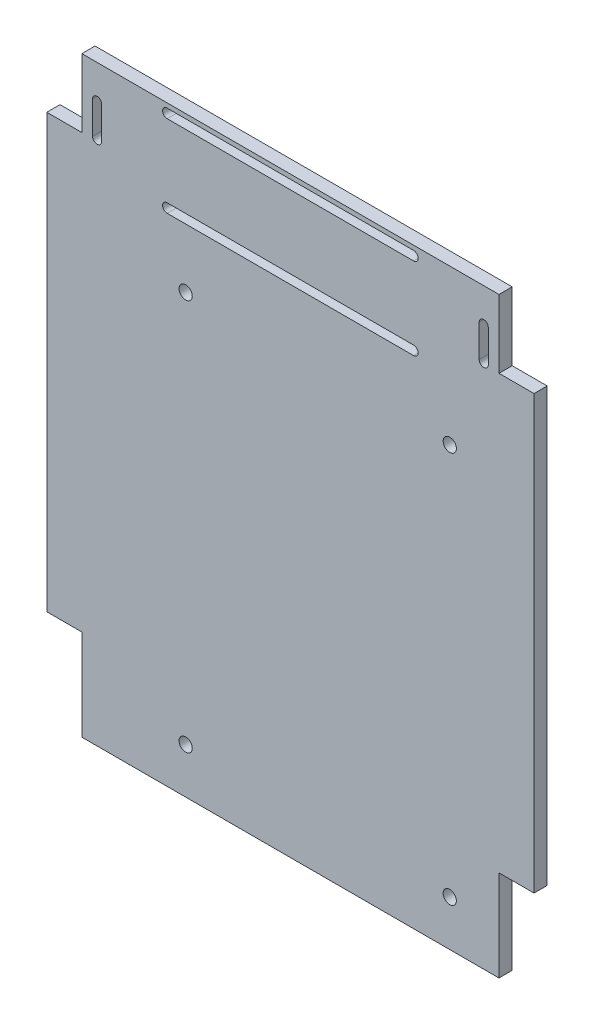
ISO-10303-21;
HEADER;
FILE_DESCRIPTION(('STEP AP214'),'2;1');
FILE_NAME('part.step','',(''),(''),'','','');
FILE_SCHEMA(('AUTOMOTIVE_DESIGN { 1 0 10303 214 1 1 1 1 }'));
ENDSEC;
DATA;
#1=APPLICATION_CONTEXT('core data for automotive mechanical design processes');
#2=APPLICATION_PROTOCOL_DEFINITION('international standard','automotive_design',2000,#1);
#3=PRODUCT_CONTEXT('',#1,'mechanical');
#4=PRODUCT('Part','Part','',(#3));
#5=PRODUCT_RELATED_PRODUCT_CATEGORY('part','',(#4));
#6=PRODUCT_DEFINITION_FORMATION('','',#4);
#7=PRODUCT_DEFINITION_CONTEXT('part definition',#1,'design');
#8=PRODUCT_DEFINITION('design','',#6,#7);
#9=PRODUCT_DEFINITION_SHAPE('','',#8);
#10=(LENGTH_UNIT() NAMED_UNIT(*) SI_UNIT(.MILLI.,.METRE.));
#11=(NAMED_UNIT(*) PLANE_ANGLE_UNIT() SI_UNIT($,.RADIAN.));
#12=(NAMED_UNIT(*) SI_UNIT($,.STERADIAN.) SOLID_ANGLE_UNIT());
#13=UNCERTAINTY_MEASURE_WITH_UNIT(LENGTH_MEASURE(1.E-05),#10,'distance_accuracy_value','');
#14=(GEOMETRIC_REPRESENTATION_CONTEXT(3) GLOBAL_UNCERTAINTY_ASSIGNED_CONTEXT((#13)) GLOBAL_UNIT_ASSIGNED_CONTEXT((#10,
#11,#12)) REPRESENTATION_CONTEXT('',''));
#15=CARTESIAN_POINT('',(0.,0.,0.));
#16=DIRECTION('',(0.,0.,1.));
#17=DIRECTION('',(1.,0.,0.));
#18=AXIS2_PLACEMENT_3D('',#15,#16,#17);
#19=CARTESIAN_POINT('',(0.,0.,2.9));
#20=DIRECTION('',(0.,0.,1.));
#21=DIRECTION('',(1.,0.,0.));
#22=AXIS2_PLACEMENT_3D('',#19,#20,#21);
#23=PLANE('',#22);
#24=CARTESIAN_POINT('',(35.,28.5,2.9));
#25=DIRECTION('',(0.,0.,1.));
#26=DIRECTION('',(1.,0.,0.));
#27=AXIS2_PLACEMENT_3D('',#24,#25,#26);
#28=CIRCLE('',#27,1.45);
#29=CARTESIAN_POINT('',(36.45,28.5,2.9));
#30=VERTEX_POINT('',#29);
#31=EDGE_CURVE('E367',#30,#30,#28,.T.);
#32=ORIENTED_EDGE('',*,*,#31,.F.);
#33=EDGE_LOOP('',(#32));
#34=FACE_BOUND('',#33,.T.);
#35=CARTESIAN_POINT('',(-23.,28.5,2.9));
#36=DIRECTION('',(0.,0.,1.));
#37=DIRECTION('',(1.,0.,0.));
#38=AXIS2_PLACEMENT_3D('',#35,#36,#37);
#39=CIRCLE('',#38,1.45);
#40=CARTESIAN_POINT('',(-21.55,28.5,2.9));
#41=VERTEX_POINT('',#40);
#42=EDGE_CURVE('E383',#41,#41,#39,.T.);
#43=ORIENTED_EDGE('',*,*,#42,.F.);
#44=EDGE_LOOP('',(#43));
#45=FACE_BOUND('',#44,.T.);
#46=DIRECTION('',(-1.,0.,0.));
#47=VECTOR('',#46,1.);
#48=CARTESIAN_POINT('',(45.8039051775926,47.5,2.9));
#49=LINE('',#48,#47);
#50=CARTESIAN_POINT('',(53.5,47.5,2.9));
#51=VERTEX_POINT('',#50);
#52=CARTESIAN_POINT('',(45.8039051775926,47.5,2.9));
#53=VERTEX_POINT('',#52);
#54=EDGE_CURVE('E434',#51,#53,#49,.T.);
#55=ORIENTED_EDGE('',*,*,#54,.T.);
#56=DIRECTION('',(0.,1.,0.));
#57=VECTOR('',#56,1.);
#58=CARTESIAN_POINT('',(45.8039051775926,47.5,2.9));
#59=LINE('',#58,#57);
#60=CARTESIAN_POINT('',(45.8039051775926,62.5,2.9));
#61=VERTEX_POINT('',#60);
#62=EDGE_CURVE('E438',#53,#61,#59,.T.);
#63=ORIENTED_EDGE('',*,*,#62,.T.);
#64=DIRECTION('',(-1.,0.,0.));
#65=VECTOR('',#64,1.);
#66=CARTESIAN_POINT('',(45.8039051775926,62.5,2.9));
#67=LINE('',#66,#65);
#68=CARTESIAN_POINT('',(-45.8,62.5,2.9));
#69=VERTEX_POINT('',#68);
#70=EDGE_CURVE('E442',#61,#69,#67,.T.);
#71=ORIENTED_EDGE('',*,*,#70,.T.);
#72=DIRECTION('',(0.,-1.,0.));
#73=VECTOR('',#72,1.);
#74=CARTESIAN_POINT('',(-45.8,47.5,2.9));
#75=LINE('',#74,#73);
#76=CARTESIAN_POINT('',(-45.8,47.5,2.9));
#77=VERTEX_POINT('',#76);
#78=EDGE_CURVE('E445',#69,#77,#75,.T.);
#79=ORIENTED_EDGE('',*,*,#78,.T.);
#80=DIRECTION('',(-1.,0.,0.));
#81=VECTOR('',#80,1.);
#82=CARTESIAN_POINT('',(-53.5,47.5,2.9));
#83=LINE('',#82,#81);
#84=CARTESIAN_POINT('',(-53.5,47.5,2.9));
#85=VERTEX_POINT('',#84);
#86=EDGE_CURVE('E448',#77,#85,#83,.T.);
#87=ORIENTED_EDGE('',*,*,#86,.T.);
#88=DIRECTION('',(0.,-1.,0.));
#89=VECTOR('',#88,1.);
#90=CARTESIAN_POINT('',(-53.5,-47.5,2.9));
#91=LINE('',#90,#89);
#92=CARTESIAN_POINT('',(-53.5,-47.5,2.9));
#93=VERTEX_POINT('',#92);
#94=EDGE_CURVE('E451',#85,#93,#91,.T.);
#95=ORIENTED_EDGE('',*,*,#94,.T.);
#96=DIRECTION('',(1.,0.,0.));
#97=VECTOR('',#96,1.);
#98=CARTESIAN_POINT('',(-53.5,-47.5,2.9));
#99=LINE('',#98,#97);
#100=CARTESIAN_POINT('',(-45.8,-47.5,2.9));
#101=VERTEX_POINT('',#100);
#102=EDGE_CURVE('E454',#93,#101,#99,.T.);
#103=ORIENTED_EDGE('',*,*,#102,.T.);
#104=DIRECTION('',(0.,-1.,0.));
#105=VECTOR('',#104,1.);
#106=CARTESIAN_POINT('',(-45.8,-47.5,2.9));
#107=LINE('',#106,#105);
#108=CARTESIAN_POINT('',(-45.8,-67.5,2.9));
#109=VERTEX_POINT('',#108);
#110=EDGE_CURVE('E457',#101,#109,#107,.T.);
#111=ORIENTED_EDGE('',*,*,#110,.T.);
#112=DIRECTION('',(1.,0.,0.));
#113=VECTOR('',#112,1.);
#114=CARTESIAN_POINT('',(-45.8,-67.5,2.9));
#115=LINE('',#114,#113);
#116=CARTESIAN_POINT('',(45.8,-67.5,2.9));
#117=VERTEX_POINT('',#116);
#118=EDGE_CURVE('E460',#109,#117,#115,.T.);
#119=ORIENTED_EDGE('',*,*,#118,.T.);
#120=DIRECTION('',(0.,1.,0.));
#121=VECTOR('',#120,1.);
#122=CARTESIAN_POINT('',(45.8,-67.5,2.9));
#123=LINE('',#122,#121);
#124=CARTESIAN_POINT('',(45.8,-47.5,2.9));
#125=VERTEX_POINT('',#124);
#126=EDGE_CURVE('E463',#117,#125,#123,.T.);
#127=ORIENTED_EDGE('',*,*,#126,.T.);
#128=DIRECTION('',(1.,0.,0.));
#129=VECTOR('',#128,1.);
#130=CARTESIAN_POINT('',(45.8,-47.5,2.9));
#131=LINE('',#130,#129);
#132=CARTESIAN_POINT('',(53.5,-47.5,2.9));
#133=VERTEX_POINT('',#132);
#134=EDGE_CURVE('E466',#125,#133,#131,.T.);
#135=ORIENTED_EDGE('',*,*,#134,.T.);
#136=DIRECTION('',(0.,1.,0.));
#137=VECTOR('',#136,1.);
#138=CARTESIAN_POINT('',(53.5,-47.5,2.9));
#139=LINE('',#138,#137);
#140=EDGE_CURVE('E469',#133,#51,#139,.T.);
#141=ORIENTED_EDGE('',*,*,#140,.T.);
#142=EDGE_LOOP('',(#55,#63,#71,#79,#87,#95,#103,#111,#119,#127,#135,#141));
#143=FACE_BOUND('',#142,.T.);
#144=DIRECTION('',(1.,0.,0.));
#145=VECTOR('',#144,1.);
#146=CARTESIAN_POINT('',(-27.0638543828596,59.5,2.9));
#147=LINE('',#146,#145);
#148=CARTESIAN_POINT('',(-27.0638543828596,59.5,2.9));
#149=VERTEX_POINT('',#148);
#150=CARTESIAN_POINT('',(27.0638543828596,59.5,2.9));
#151=VERTEX_POINT('',#150);
#152=EDGE_CURVE('E394',#149,#151,#147,.T.);
#153=ORIENTED_EDGE('',*,*,#152,.F.);
#154=CARTESIAN_POINT('',(-27.0638543828596,60.5,2.9));
#155=DIRECTION('',(0.,0.,1.));
#156=DIRECTION('',(1.,0.,0.));
#157=AXIS2_PLACEMENT_3D('',#154,#155,#156);
#158=CIRCLE('',#157,1.);
#159=CARTESIAN_POINT('',(-27.0638543828596,61.5,2.9));
#160=VERTEX_POINT('',#159);
#161=EDGE_CURVE('E391',#160,#149,#158,.T.);
#162=ORIENTED_EDGE('',*,*,#161,.F.);
#163=DIRECTION('',(-1.,0.,0.));
#164=VECTOR('',#163,1.);
#165=CARTESIAN_POINT('',(-27.0638543828596,61.5,2.9));
#166=LINE('',#165,#164);
#167=CARTESIAN_POINT('',(27.0638543828596,61.5,2.9));
#168=VERTEX_POINT('',#167);
#169=EDGE_CURVE('E402',#168,#160,#166,.T.);
#170=ORIENTED_EDGE('',*,*,#169,.F.);
#171=CARTESIAN_POINT('',(27.0638543828596,60.5,2.9));
#172=DIRECTION('',(0.,0.,1.));
#173=DIRECTION('',(1.,0.,0.));
#174=AXIS2_PLACEMENT_3D('',#171,#172,#173);
#175=CIRCLE('',#174,1.);
#176=EDGE_CURVE('E398',#151,#168,#175,.T.);
#177=ORIENTED_EDGE('',*,*,#176,.F.);
#178=EDGE_LOOP('',(#153,#162,#170,#177));
#179=FACE_BOUND('',#178,.T.);
#180=CARTESIAN_POINT('',(35.,-57.5,2.9));
#181=DIRECTION('',(0.,0.,1.));
#182=DIRECTION('',(1.,0.,0.));
#183=AXIS2_PLACEMENT_3D('',#180,#181,#182);
#184=CIRCLE('',#183,1.44999999999999);
#185=CARTESIAN_POINT('',(36.45,-57.5,2.9));
#186=VERTEX_POINT('',#185);
#187=EDGE_CURVE('E375',#186,#186,#184,.T.);
#188=ORIENTED_EDGE('',*,*,#187,.F.);
#189=EDGE_LOOP('',(#188));
#190=FACE_BOUND('',#189,.T.);
#191=CARTESIAN_POINT('',(-23.,-57.5,2.9));
#192=DIRECTION('',(0.,0.,1.));
#193=DIRECTION('',(1.,0.,0.));
#194=AXIS2_PLACEMENT_3D('',#191,#192,#193);
#195=CIRCLE('',#194,1.44999999999999);
#196=CARTESIAN_POINT('',(-21.55,-57.5,2.9));
#197=VERTEX_POINT('',#196);
#198=EDGE_CURVE('E359',#197,#197,#195,.T.);
#199=ORIENTED_EDGE('',*,*,#198,.F.);
#200=EDGE_LOOP('',(#199));
#201=FACE_BOUND('',#200,.T.);
#202=DIRECTION('',(1.,0.,0.));
#203=VECTOR('',#202,1.);
#204=CARTESIAN_POINT('',(-27.0638543828596,41.5,2.9));
#205=LINE('',#204,#203);
#206=CARTESIAN_POINT('',(-27.0638543828596,41.5,2.9));
#207=VERTEX_POINT('',#206);
#208=CARTESIAN_POINT('',(27.0638543828596,41.5,2.9));
#209=VERTEX_POINT('',#208);
#210=EDGE_CURVE('E319',#207,#209,#205,.T.);
#211=ORIENTED_EDGE('',*,*,#210,.F.);
#212=CARTESIAN_POINT('',(-27.0638543828596,42.5,2.9));
#213=DIRECTION('',(0.,0.,1.));
#214=DIRECTION('',(-1.,0.,0.));
#215=AXIS2_PLACEMENT_3D('',#212,#213,#214);
#216=CIRCLE('',#215,1.);
#217=CARTESIAN_POINT('',(-27.0638543828596,43.5,2.9));
#218=VERTEX_POINT('',#217);
#219=EDGE_CURVE('E316',#218,#207,#216,.T.);
#220=ORIENTED_EDGE('',*,*,#219,.F.);
#221=DIRECTION('',(-1.,0.,0.));
#222=VECTOR('',#221,1.);
#223=CARTESIAN_POINT('',(-27.0638543828596,43.5,2.9));
#224=LINE('',#223,#222);
#225=CARTESIAN_POINT('',(27.0638543828596,43.5,2.9));
#226=VERTEX_POINT('',#225);
#227=EDGE_CURVE('E327',#226,#218,#224,.T.);
#228=ORIENTED_EDGE('',*,*,#227,.F.);
#229=CARTESIAN_POINT('',(27.0638543828596,42.5,2.9));
#230=DIRECTION('',(0.,0.,1.));
#231=DIRECTION('',(-1.,0.,0.));
#232=AXIS2_PLACEMENT_3D('',#229,#230,#231);
#233=CIRCLE('',#232,1.);
#234=EDGE_CURVE('E323',#209,#226,#233,.T.);
#235=ORIENTED_EDGE('',*,*,#234,.F.);
#236=EDGE_LOOP('',(#211,#220,#228,#235));
#237=FACE_BOUND('',#236,.T.);
#238=DIRECTION('',(0.,-1.,0.));
#239=VECTOR('',#238,1.);
#240=CARTESIAN_POINT('',(-43.4566194207235,55.0590173762344,2.9));
#241=LINE('',#240,#239);
#242=CARTESIAN_POINT('',(-43.4566194207235,55.0590173762344,2.9));
#243=VERTEX_POINT('',#242);
#244=CARTESIAN_POINT('',(-43.4566194207235,47.9409826237656,2.9));
#245=VERTEX_POINT('',#244);
#246=EDGE_CURVE('E276',#243,#245,#241,.T.);
#247=ORIENTED_EDGE('',*,*,#246,.F.);
#248=CARTESIAN_POINT('',(-42.4566194207235,55.0590173762344,2.9));
#249=DIRECTION('',(0.,0.,1.));
#250=DIRECTION('',(1.,0.,0.));
#251=AXIS2_PLACEMENT_3D('',#248,#249,#250);
#252=CIRCLE('',#251,1.);
#253=CARTESIAN_POINT('',(-41.4566194207235,55.0590173762344,2.9));
#254=VERTEX_POINT('',#253);
#255=EDGE_CURVE('E273',#254,#243,#252,.T.);
#256=ORIENTED_EDGE('',*,*,#255,.F.);
#257=DIRECTION('',(0.,1.,0.));
#258=VECTOR('',#257,1.);
#259=CARTESIAN_POINT('',(-41.4566194207235,55.0590173762344,2.9));
#260=LINE('',#259,#258);
#261=CARTESIAN_POINT('',(-41.4566194207235,47.9409826237656,2.9));
#262=VERTEX_POINT('',#261);
#263=EDGE_CURVE('E284',#262,#254,#260,.T.);
#264=ORIENTED_EDGE('',*,*,#263,.F.);
#265=CARTESIAN_POINT('',(-42.4566194207235,47.9409826237656,2.9));
#266=DIRECTION('',(0.,0.,1.));
#267=DIRECTION('',(1.,0.,0.));
#268=AXIS2_PLACEMENT_3D('',#265,#266,#267);
#269=CIRCLE('',#268,1.);
#270=EDGE_CURVE('E280',#245,#262,#269,.T.);
#271=ORIENTED_EDGE('',*,*,#270,.F.);
#272=EDGE_LOOP('',(#247,#256,#264,#271));
#273=FACE_BOUND('',#272,.T.);
#274=DIRECTION('',(0.,-1.,0.));
#275=VECTOR('',#274,1.);
#276=CARTESIAN_POINT('',(41.4566194207235,55.0590173762344,2.9));
#277=LINE('',#276,#275);
#278=CARTESIAN_POINT('',(41.4566194207235,55.0590173762344,2.9));
#279=VERTEX_POINT('',#278);
#280=CARTESIAN_POINT('',(41.4566194207235,47.9409826237656,2.9));
#281=VERTEX_POINT('',#280);
#282=EDGE_CURVE('E234',#279,#281,#277,.T.);
#283=ORIENTED_EDGE('',*,*,#282,.F.);
#284=CARTESIAN_POINT('',(42.4566194207235,55.0590173762344,2.9));
#285=DIRECTION('',(0.,0.,1.));
#286=DIRECTION('',(-1.,0.,0.));
#287=AXIS2_PLACEMENT_3D('',#284,#285,#286);
#288=CIRCLE('',#287,1.);
#289=CARTESIAN_POINT('',(43.4566194207235,55.0590173762344,2.9));
#290=VERTEX_POINT('',#289);
#291=EDGE_CURVE('E225',#290,#279,#288,.T.);
#292=ORIENTED_EDGE('',*,*,#291,.F.);
#293=DIRECTION('',(0.,1.,0.));
#294=VECTOR('',#293,1.);
#295=CARTESIAN_POINT('',(43.4566194207235,55.0590173762344,2.9));
#296=LINE('',#295,#294);
#297=CARTESIAN_POINT('',(43.4566194207235,47.9409826237656,2.9));
#298=VERTEX_POINT('',#297);
#299=EDGE_CURVE('E251',#298,#290,#296,.T.);
#300=ORIENTED_EDGE('',*,*,#299,.F.);
#301=CARTESIAN_POINT('',(42.4566194207235,47.9409826237656,2.9));
#302=DIRECTION('',(0.,0.,1.));
#303=DIRECTION('',(-1.,0.,0.));
#304=AXIS2_PLACEMENT_3D('',#301,#302,#303);
#305=CIRCLE('',#304,1.);
#306=EDGE_CURVE('E247',#281,#298,#305,.T.);
#307=ORIENTED_EDGE('',*,*,#306,.F.);
#308=EDGE_LOOP('',(#283,#292,#300,#307));
#309=FACE_BOUND('',#308,.T.);
#310=ADVANCED_FACE('F39',(#34,#45,#143,#179,#190,#201,#237,#273,#309),#23,.T.);
#311=CARTESIAN_POINT('',(0.,0.,0.));
#312=DIRECTION('',(0.,0.,1.));
#313=DIRECTION('',(1.,0.,0.));
#314=AXIS2_PLACEMENT_3D('',#311,#312,#313);
#315=PLANE('',#314);
#316=CARTESIAN_POINT('',(-42.4566194207235,55.0590173762344,0.));
#317=DIRECTION('',(0.,0.,1.));
#318=DIRECTION('',(1.,0.,0.));
#319=AXIS2_PLACEMENT_3D('',#316,#317,#318);
#320=CIRCLE('',#319,1.);
#321=CARTESIAN_POINT('',(-41.4566194207235,55.0590173762344,0.));
#322=VERTEX_POINT('',#321);
#323=CARTESIAN_POINT('',(-43.4566194207235,55.0590173762344,0.));
#324=VERTEX_POINT('',#323);
#325=EDGE_CURVE('E243',#322,#324,#320,.T.);
#326=ORIENTED_EDGE('',*,*,#325,.T.);
#327=DIRECTION('',(0.,-1.,0.));
#328=VECTOR('',#327,1.);
#329=CARTESIAN_POINT('',(-43.4566194207235,55.0590173762344,0.));
#330=LINE('',#329,#328);
#331=CARTESIAN_POINT('',(-43.4566194207235,47.9409826237656,0.));
#332=VERTEX_POINT('',#331);
#333=EDGE_CURVE('E291',#324,#332,#330,.T.);
#334=ORIENTED_EDGE('',*,*,#333,.T.);
#335=CARTESIAN_POINT('',(-42.4566194207235,47.9409826237656,0.));
#336=DIRECTION('',(0.,0.,1.));
#337=DIRECTION('',(1.,0.,0.));
#338=AXIS2_PLACEMENT_3D('',#335,#336,#337);
#339=CIRCLE('',#338,1.);
#340=CARTESIAN_POINT('',(-41.4566194207235,47.9409826237656,0.));
#341=VERTEX_POINT('',#340);
#342=EDGE_CURVE('E295',#332,#341,#339,.T.);
#343=ORIENTED_EDGE('',*,*,#342,.T.);
#344=DIRECTION('',(0.,1.,0.));
#345=VECTOR('',#344,1.);
#346=CARTESIAN_POINT('',(-41.4566194207235,55.0590173762344,0.));
#347=LINE('',#346,#345);
#348=EDGE_CURVE('E277',#341,#322,#347,.T.);
#349=ORIENTED_EDGE('',*,*,#348,.T.);
#350=EDGE_LOOP('',(#326,#334,#343,#349));
#351=FACE_BOUND('',#350,.T.);
#352=CARTESIAN_POINT('',(-23.,-57.5,0.));
#353=DIRECTION('',(0.,0.,1.));
#354=DIRECTION('',(1.,0.,0.));
#355=AXIS2_PLACEMENT_3D('',#352,#353,#354);
#356=CIRCLE('',#355,1.44999999999999);
#357=CARTESIAN_POINT('',(-21.55,-57.5,0.));
#358=VERTEX_POINT('',#357);
#359=EDGE_CURVE('E358',#358,#358,#356,.T.);
#360=ORIENTED_EDGE('',*,*,#359,.T.);
#361=EDGE_LOOP('',(#360));
#362=FACE_BOUND('',#361,.T.);
#363=CARTESIAN_POINT('',(35.,28.5,0.));
#364=DIRECTION('',(0.,0.,1.));
#365=DIRECTION('',(1.,0.,0.));
#366=AXIS2_PLACEMENT_3D('',#363,#364,#365);
#367=CIRCLE('',#366,1.45);
#368=CARTESIAN_POINT('',(36.45,28.5,0.));
#369=VERTEX_POINT('',#368);
#370=EDGE_CURVE('E363',#369,#369,#367,.T.);
#371=ORIENTED_EDGE('',*,*,#370,.T.);
#372=EDGE_LOOP('',(#371));
#373=FACE_BOUND('',#372,.T.);
#374=CARTESIAN_POINT('',(35.,-57.5,0.));
#375=DIRECTION('',(0.,0.,1.));
#376=DIRECTION('',(1.,0.,0.));
#377=AXIS2_PLACEMENT_3D('',#374,#375,#376);
#378=CIRCLE('',#377,1.44999999999999);
#379=CARTESIAN_POINT('',(36.45,-57.5,0.));
#380=VERTEX_POINT('',#379);
#381=EDGE_CURVE('E371',#380,#380,#378,.T.);
#382=ORIENTED_EDGE('',*,*,#381,.T.);
#383=EDGE_LOOP('',(#382));
#384=FACE_BOUND('',#383,.T.);
#385=CARTESIAN_POINT('',(-23.,28.5,0.));
#386=DIRECTION('',(0.,0.,1.));
#387=DIRECTION('',(1.,0.,0.));
#388=AXIS2_PLACEMENT_3D('',#385,#386,#387);
#389=CIRCLE('',#388,1.45);
#390=CARTESIAN_POINT('',(-21.55,28.5,0.));
#391=VERTEX_POINT('',#390);
#392=EDGE_CURVE('E379',#391,#391,#389,.T.);
#393=ORIENTED_EDGE('',*,*,#392,.T.);
#394=EDGE_LOOP('',(#393));
#395=FACE_BOUND('',#394,.T.);
#396=CARTESIAN_POINT('',(-27.0638543828596,60.5,0.));
#397=DIRECTION('',(0.,0.,1.));
#398=DIRECTION('',(1.,0.,0.));
#399=AXIS2_PLACEMENT_3D('',#396,#397,#398);
#400=CIRCLE('',#399,1.);
#401=CARTESIAN_POINT('',(-27.0638543828596,61.5,0.));
#402=VERTEX_POINT('',#401);
#403=CARTESIAN_POINT('',(-27.0638543828596,59.5,0.));
#404=VERTEX_POINT('',#403);
#405=EDGE_CURVE('E387',#402,#404,#400,.T.);
#406=ORIENTED_EDGE('',*,*,#405,.T.);
#407=DIRECTION('',(1.,0.,0.));
#408=VECTOR('',#407,1.);
#409=CARTESIAN_POINT('',(-27.0638543828596,59.5,0.));
#410=LINE('',#409,#408);
#411=CARTESIAN_POINT('',(27.0638543828596,59.5,0.));
#412=VERTEX_POINT('',#411);
#413=EDGE_CURVE('E409',#404,#412,#410,.T.);
#414=ORIENTED_EDGE('',*,*,#413,.T.);
#415=CARTESIAN_POINT('',(27.0638543828596,60.5,0.));
#416=DIRECTION('',(0.,0.,1.));
#417=DIRECTION('',(1.,0.,0.));
#418=AXIS2_PLACEMENT_3D('',#415,#416,#417);
#419=CIRCLE('',#418,1.);
#420=CARTESIAN_POINT('',(27.0638543828596,61.5,0.));
#421=VERTEX_POINT('',#420);
#422=EDGE_CURVE('E413',#412,#421,#419,.T.);
#423=ORIENTED_EDGE('',*,*,#422,.T.);
#424=DIRECTION('',(-1.,0.,0.));
#425=VECTOR('',#424,1.);
#426=CARTESIAN_POINT('',(-27.0638543828596,61.5,0.));
#427=LINE('',#426,#425);
#428=EDGE_CURVE('E395',#421,#402,#427,.T.);
#429=ORIENTED_EDGE('',*,*,#428,.T.);
#430=EDGE_LOOP('',(#406,#414,#423,#429));
#431=FACE_BOUND('',#430,.T.);
#432=DIRECTION('',(-1.,0.,0.));
#433=VECTOR('',#432,1.);
#434=CARTESIAN_POINT('',(45.8039051775926,47.5,0.));
#435=LINE('',#434,#433);
#436=CARTESIAN_POINT('',(53.5,47.5,0.));
#437=VERTEX_POINT('',#436);
#438=CARTESIAN_POINT('',(45.8039051775926,47.5,0.));
#439=VERTEX_POINT('',#438);
#440=EDGE_CURVE('E433',#437,#439,#435,.T.);
#441=ORIENTED_EDGE('',*,*,#440,.F.);
#442=DIRECTION('',(0.,1.,0.));
#443=VECTOR('',#442,1.);
#444=CARTESIAN_POINT('',(53.5,-47.5,0.));
#445=LINE('',#444,#443);
#446=CARTESIAN_POINT('',(53.5,-47.5,0.));
#447=VERTEX_POINT('',#446);
#448=EDGE_CURVE('E439',#447,#437,#445,.T.);
#449=ORIENTED_EDGE('',*,*,#448,.F.);
#450=DIRECTION('',(1.,0.,0.));
#451=VECTOR('',#450,1.);
#452=CARTESIAN_POINT('',(45.8,-47.5,0.));
#453=LINE('',#452,#451);
#454=CARTESIAN_POINT('',(45.8,-47.5,0.));
#455=VERTEX_POINT('',#454);
#456=EDGE_CURVE('E503',#455,#447,#453,.T.);
#457=ORIENTED_EDGE('',*,*,#456,.F.);
#458=DIRECTION('',(0.,1.,0.));
#459=VECTOR('',#458,1.);
#460=CARTESIAN_POINT('',(45.8,-67.5,0.));
#461=LINE('',#460,#459);
#462=CARTESIAN_POINT('',(45.8,-67.5,0.));
#463=VERTEX_POINT('',#462);
#464=EDGE_CURVE('E500',#463,#455,#461,.T.);
#465=ORIENTED_EDGE('',*,*,#464,.F.);
#466=DIRECTION('',(1.,0.,0.));
#467=VECTOR('',#466,1.);
#468=CARTESIAN_POINT('',(-45.8,-67.5,0.));
#469=LINE('',#468,#467);
#470=CARTESIAN_POINT('',(-45.8,-67.5,0.));
#471=VERTEX_POINT('',#470);
#472=EDGE_CURVE('E497',#471,#463,#469,.T.);
#473=ORIENTED_EDGE('',*,*,#472,.F.);
#474=DIRECTION('',(0.,-1.,0.));
#475=VECTOR('',#474,1.);
#476=CARTESIAN_POINT('',(-45.8,-47.5,0.));
#477=LINE('',#476,#475);
#478=CARTESIAN_POINT('',(-45.8,-47.5,0.));
#479=VERTEX_POINT('',#478);
#480=EDGE_CURVE('E494',#479,#471,#477,.T.);
#481=ORIENTED_EDGE('',*,*,#480,.F.);
#482=DIRECTION('',(1.,0.,0.));
#483=VECTOR('',#482,1.);
#484=CARTESIAN_POINT('',(-53.5,-47.5,0.));
#485=LINE('',#484,#483);
#486=CARTESIAN_POINT('',(-53.5,-47.5,0.));
#487=VERTEX_POINT('',#486);
#488=EDGE_CURVE('E491',#487,#479,#485,.T.);
#489=ORIENTED_EDGE('',*,*,#488,.F.);
#490=DIRECTION('',(0.,-1.,0.));
#491=VECTOR('',#490,1.);
#492=CARTESIAN_POINT('',(-53.5,-47.5,0.));
#493=LINE('',#492,#491);
#494=CARTESIAN_POINT('',(-53.5,47.5,0.));
#495=VERTEX_POINT('',#494);
#496=EDGE_CURVE('E488',#495,#487,#493,.T.);
#497=ORIENTED_EDGE('',*,*,#496,.F.);
#498=DIRECTION('',(-1.,0.,0.));
#499=VECTOR('',#498,1.);
#500=CARTESIAN_POINT('',(-53.5,47.5,0.));
#501=LINE('',#500,#499);
#502=CARTESIAN_POINT('',(-45.8,47.5,0.));
#503=VERTEX_POINT('',#502);
#504=EDGE_CURVE('E485',#503,#495,#501,.T.);
#505=ORIENTED_EDGE('',*,*,#504,.F.);
#506=DIRECTION('',(0.,-1.,0.));
#507=VECTOR('',#506,1.);
#508=CARTESIAN_POINT('',(-45.8,47.5,0.));
#509=LINE('',#508,#507);
#510=CARTESIAN_POINT('',(-45.8,62.5,0.));
#511=VERTEX_POINT('',#510);
#512=EDGE_CURVE('E482',#511,#503,#509,.T.);
#513=ORIENTED_EDGE('',*,*,#512,.F.);
#514=DIRECTION('',(-1.,0.,0.));
#515=VECTOR('',#514,1.);
#516=CARTESIAN_POINT('',(45.8039051775926,62.5,0.));
#517=LINE('',#516,#515);
#518=CARTESIAN_POINT('',(45.8039051775926,62.5,0.));
#519=VERTEX_POINT('',#518);
#520=EDGE_CURVE('E479',#519,#511,#517,.T.);
#521=ORIENTED_EDGE('',*,*,#520,.F.);
#522=DIRECTION('',(0.,1.,0.));
#523=VECTOR('',#522,1.);
#524=CARTESIAN_POINT('',(45.8039051775926,47.5,0.));
#525=LINE('',#524,#523);
#526=EDGE_CURVE('E476',#439,#519,#525,.T.);
#527=ORIENTED_EDGE('',*,*,#526,.F.);
#528=EDGE_LOOP('',(#441,#449,#457,#465,#473,#481,#489,#497,#505,#513,#521,#527));
#529=FACE_BOUND('',#528,.T.);
#530=CARTESIAN_POINT('',(-27.0638543828596,42.5,0.));
#531=DIRECTION('',(0.,0.,1.));
#532=DIRECTION('',(-1.,0.,0.));
#533=AXIS2_PLACEMENT_3D('',#530,#531,#532);
#534=CIRCLE('',#533,1.);
#535=CARTESIAN_POINT('',(-27.0638543828596,43.5,0.));
#536=VERTEX_POINT('',#535);
#537=CARTESIAN_POINT('',(-27.0638543828596,41.5,0.));
#538=VERTEX_POINT('',#537);
#539=EDGE_CURVE('E315',#536,#538,#534,.T.);
#540=ORIENTED_EDGE('',*,*,#539,.T.);
#541=DIRECTION('',(1.,0.,0.));
#542=VECTOR('',#541,1.);
#543=CARTESIAN_POINT('',(-27.0638543828596,41.5,0.));
#544=LINE('',#543,#542);
#545=CARTESIAN_POINT('',(27.0638543828596,41.5,0.));
#546=VERTEX_POINT('',#545);
#547=EDGE_CURVE('E334',#538,#546,#544,.T.);
#548=ORIENTED_EDGE('',*,*,#547,.T.);
#549=CARTESIAN_POINT('',(27.0638543828596,42.5,0.));
#550=DIRECTION('',(0.,0.,1.));
#551=DIRECTION('',(-1.,0.,0.));
#552=AXIS2_PLACEMENT_3D('',#549,#550,#551);
#553=CIRCLE('',#552,1.);
#554=CARTESIAN_POINT('',(27.0638543828596,43.5,0.));
#555=VERTEX_POINT('',#554);
#556=EDGE_CURVE('E338',#546,#555,#553,.T.);
#557=ORIENTED_EDGE('',*,*,#556,.T.);
#558=DIRECTION('',(-1.,0.,0.));
#559=VECTOR('',#558,1.);
#560=CARTESIAN_POINT('',(-27.0638543828596,43.5,0.));
#561=LINE('',#560,#559);
#562=EDGE_CURVE('E320',#555,#536,#561,.T.);
#563=ORIENTED_EDGE('',*,*,#562,.T.);
#564=EDGE_LOOP('',(#540,#548,#557,#563));
#565=FACE_BOUND('',#564,.T.);
#566=CARTESIAN_POINT('',(42.4566194207235,55.0590173762344,0.));
#567=DIRECTION('',(0.,0.,1.));
#568=DIRECTION('',(-1.,0.,0.));
#569=AXIS2_PLACEMENT_3D('',#566,#567,#568);
#570=CIRCLE('',#569,1.);
#571=CARTESIAN_POINT('',(43.4566194207235,55.0590173762344,0.));
#572=VERTEX_POINT('',#571);
#573=CARTESIAN_POINT('',(41.4566194207235,55.0590173762344,0.));
#574=VERTEX_POINT('',#573);
#575=EDGE_CURVE('E63',#572,#574,#570,.T.);
#576=ORIENTED_EDGE('',*,*,#575,.T.);
#577=DIRECTION('',(0.,-1.,0.));
#578=VECTOR('',#577,1.);
#579=CARTESIAN_POINT('',(41.4566194207235,55.0590173762344,0.));
#580=LINE('',#579,#578);
#581=CARTESIAN_POINT('',(41.4566194207235,47.9409826237656,0.));
#582=VERTEX_POINT('',#581);
#583=EDGE_CURVE('E241',#574,#582,#580,.T.);
#584=ORIENTED_EDGE('',*,*,#583,.T.);
#585=CARTESIAN_POINT('',(42.4566194207235,47.9409826237656,0.));
#586=DIRECTION('',(0.,0.,1.));
#587=DIRECTION('',(-1.,0.,0.));
#588=AXIS2_PLACEMENT_3D('',#585,#586,#587);
#589=CIRCLE('',#588,1.);
#590=CARTESIAN_POINT('',(43.4566194207235,47.9409826237656,0.));
#591=VERTEX_POINT('',#590);
#592=EDGE_CURVE('E260',#582,#591,#589,.T.);
#593=ORIENTED_EDGE('',*,*,#592,.T.);
#594=DIRECTION('',(0.,1.,0.));
#595=VECTOR('',#594,1.);
#596=CARTESIAN_POINT('',(43.4566194207235,55.0590173762344,0.));
#597=LINE('',#596,#595);
#598=EDGE_CURVE('E235',#591,#572,#597,.T.);
#599=ORIENTED_EDGE('',*,*,#598,.T.);
#600=EDGE_LOOP('',(#576,#584,#593,#599));
#601=FACE_BOUND('',#600,.T.);
#602=ADVANCED_FACE('F558',(#351,#362,#373,#384,#395,#431,#529,#565,#601),#315,.F.);
#603=CARTESIAN_POINT('',(45.8039051775926,47.5,2.9));
#604=DIRECTION('',(0.,-1.,0.));
#605=DIRECTION('',(0.,0.,-1.));
#606=AXIS2_PLACEMENT_3D('',#603,#604,#605);
#607=PLANE('',#606);
#608=ORIENTED_EDGE('',*,*,#440,.T.);
#609=DIRECTION('',(0.,0.,-1.));
#610=VECTOR('',#609,1.);
#611=CARTESIAN_POINT('',(45.8039051775926,47.5,2.9));
#612=LINE('',#611,#610);
#613=EDGE_CURVE('E11',#53,#439,#612,.T.);
#614=ORIENTED_EDGE('',*,*,#613,.F.);
#615=ORIENTED_EDGE('',*,*,#54,.F.);
#616=DIRECTION('',(0.,0.,-1.));
#617=VECTOR('',#616,1.);
#618=CARTESIAN_POINT('',(53.5,47.5,2.9));
#619=LINE('',#618,#617);
#620=EDGE_CURVE('E472',#51,#437,#619,.T.);
#621=ORIENTED_EDGE('',*,*,#620,.T.);
#622=EDGE_LOOP('',(#608,#614,#615,#621));
#623=FACE_BOUND('',#622,.T.);
#624=ADVANCED_FACE('F41',(#623),#607,.F.);
#625=CARTESIAN_POINT('',(45.8039051775926,47.5,2.9));
#626=DIRECTION('',(-1.,0.,0.));
#627=DIRECTION('',(0.,-1.,0.));
#628=AXIS2_PLACEMENT_3D('',#625,#626,#627);
#629=PLANE('',#628);
#630=ORIENTED_EDGE('',*,*,#526,.T.);
#631=DIRECTION('',(0.,0.,-1.));
#632=VECTOR('',#631,1.);
#633=CARTESIAN_POINT('',(45.8039051775926,62.5,2.9));
#634=LINE('',#633,#632);
#635=EDGE_CURVE('E48',#61,#519,#634,.T.);
#636=ORIENTED_EDGE('',*,*,#635,.F.);
#637=ORIENTED_EDGE('',*,*,#62,.F.);
#638=ORIENTED_EDGE('',*,*,#613,.T.);
#639=EDGE_LOOP('',(#630,#636,#637,#638));
#640=FACE_BOUND('',#639,.T.);
#641=ADVANCED_FACE('F576',(#640),#629,.F.);
#642=CARTESIAN_POINT('',(45.8039051775926,62.5,2.9));
#643=DIRECTION('',(0.,-1.,0.));
#644=DIRECTION('',(1.,0.,0.));
#645=AXIS2_PLACEMENT_3D('',#642,#643,#644);
#646=PLANE('',#645);
#647=ORIENTED_EDGE('',*,*,#520,.T.);
#648=DIRECTION('',(0.,0.,-1.));
#649=VECTOR('',#648,1.);
#650=CARTESIAN_POINT('',(-45.8,62.5,2.9));
#651=LINE('',#650,#649);
#652=EDGE_CURVE('E543',#69,#511,#651,.T.);
#653=ORIENTED_EDGE('',*,*,#652,.F.);
#654=ORIENTED_EDGE('',*,*,#70,.F.);
#655=ORIENTED_EDGE('',*,*,#635,.T.);
#656=EDGE_LOOP('',(#647,#653,#654,#655));
#657=FACE_BOUND('',#656,.T.);
#658=ADVANCED_FACE('F552',(#657),#646,.F.);
#659=CARTESIAN_POINT('',(-45.8,47.5,2.9));
#660=DIRECTION('',(1.,0.,0.));
#661=DIRECTION('',(0.,0.,-1.));
#662=AXIS2_PLACEMENT_3D('',#659,#660,#661);
#663=PLANE('',#662);
#664=ORIENTED_EDGE('',*,*,#512,.T.);
#665=DIRECTION('',(0.,0.,-1.));
#666=VECTOR('',#665,1.);
#667=CARTESIAN_POINT('',(-45.8,47.5,2.9));
#668=LINE('',#667,#666);
#669=EDGE_CURVE('E539',#77,#503,#668,.T.);
#670=ORIENTED_EDGE('',*,*,#669,.F.);
#671=ORIENTED_EDGE('',*,*,#78,.F.);
#672=ORIENTED_EDGE('',*,*,#652,.T.);
#673=EDGE_LOOP('',(#664,#670,#671,#672));
#674=FACE_BOUND('',#673,.T.);
#675=ADVANCED_FACE('F564',(#674),#663,.F.);
#676=CARTESIAN_POINT('',(-53.5,47.5,2.9));
#677=DIRECTION('',(0.,-1.,0.));
#678=DIRECTION('',(0.,0.,-1.));
#679=AXIS2_PLACEMENT_3D('',#676,#677,#678);
#680=PLANE('',#679);
#681=ORIENTED_EDGE('',*,*,#504,.T.);
#682=DIRECTION('',(0.,0.,-1.));
#683=VECTOR('',#682,1.);
#684=CARTESIAN_POINT('',(-53.5,47.5,2.9));
#685=LINE('',#684,#683);
#686=EDGE_CURVE('E535',#85,#495,#685,.T.);
#687=ORIENTED_EDGE('',*,*,#686,.F.);
#688=ORIENTED_EDGE('',*,*,#86,.F.);
#689=ORIENTED_EDGE('',*,*,#669,.T.);
#690=EDGE_LOOP('',(#681,#687,#688,#689));
#691=FACE_BOUND('',#690,.T.);
#692=ADVANCED_FACE('F568',(#691),#680,.F.);
#693=CARTESIAN_POINT('',(-53.5,-47.5,2.9));
#694=DIRECTION('',(1.,0.,0.));
#695=DIRECTION('',(0.,0.,-1.));
#696=AXIS2_PLACEMENT_3D('',#693,#694,#695);
#697=PLANE('',#696);
#698=ORIENTED_EDGE('',*,*,#496,.T.);
#699=DIRECTION('',(0.,0.,-1.));
#700=VECTOR('',#699,1.);
#701=CARTESIAN_POINT('',(-53.5,-47.5,2.9));
#702=LINE('',#701,#700);
#703=EDGE_CURVE('E531',#93,#487,#702,.T.);
#704=ORIENTED_EDGE('',*,*,#703,.F.);
#705=ORIENTED_EDGE('',*,*,#94,.F.);
#706=ORIENTED_EDGE('',*,*,#686,.T.);
#707=EDGE_LOOP('',(#698,#704,#705,#706));
#708=FACE_BOUND('',#707,.T.);
#709=ADVANCED_FACE('F609',(#708),#697,.F.);
#710=CARTESIAN_POINT('',(-53.5,-47.5,2.9));
#711=DIRECTION('',(0.,1.,0.));
#712=DIRECTION('',(0.,0.,1.));
#713=AXIS2_PLACEMENT_3D('',#710,#711,#712);
#714=PLANE('',#713);
#715=ORIENTED_EDGE('',*,*,#488,.T.);
#716=DIRECTION('',(0.,0.,-1.));
#717=VECTOR('',#716,1.);
#718=CARTESIAN_POINT('',(-45.8,-47.5,2.9));
#719=LINE('',#718,#717);
#720=EDGE_CURVE('E527',#101,#479,#719,.T.);
#721=ORIENTED_EDGE('',*,*,#720,.F.);
#722=ORIENTED_EDGE('',*,*,#102,.F.);
#723=ORIENTED_EDGE('',*,*,#703,.T.);
#724=EDGE_LOOP('',(#715,#721,#722,#723));
#725=FACE_BOUND('',#724,.T.);
#726=ADVANCED_FACE('F607',(#725),#714,.F.);
#727=CARTESIAN_POINT('',(-45.8,-47.5,2.9));
#728=DIRECTION('',(1.,0.,0.));
#729=DIRECTION('',(0.,0.,-1.));
#730=AXIS2_PLACEMENT_3D('',#727,#728,#729);
#731=PLANE('',#730);
#732=ORIENTED_EDGE('',*,*,#480,.T.);
#733=DIRECTION('',(0.,0.,-1.));
#734=VECTOR('',#733,1.);
#735=CARTESIAN_POINT('',(-45.8,-67.5,2.9));
#736=LINE('',#735,#734);
#737=EDGE_CURVE('E523',#109,#471,#736,.T.);
#738=ORIENTED_EDGE('',*,*,#737,.F.);
#739=ORIENTED_EDGE('',*,*,#110,.F.);
#740=ORIENTED_EDGE('',*,*,#720,.T.);
#741=EDGE_LOOP('',(#732,#738,#739,#740));
#742=FACE_BOUND('',#741,.T.);
#743=ADVANCED_FACE('F603',(#742),#731,.F.);
#744=CARTESIAN_POINT('',(-45.8,-67.5,2.9));
#745=DIRECTION('',(0.,1.,0.));
#746=DIRECTION('',(0.,0.,1.));
#747=AXIS2_PLACEMENT_3D('',#744,#745,#746);
#748=PLANE('',#747);
#749=ORIENTED_EDGE('',*,*,#472,.T.);
#750=DIRECTION('',(0.,0.,-1.));
#751=VECTOR('',#750,1.);
#752=CARTESIAN_POINT('',(45.8,-67.5,2.9));
#753=LINE('',#752,#751);
#754=EDGE_CURVE('E519',#117,#463,#753,.T.);
#755=ORIENTED_EDGE('',*,*,#754,.F.);
#756=ORIENTED_EDGE('',*,*,#118,.F.);
#757=ORIENTED_EDGE('',*,*,#737,.T.);
#758=EDGE_LOOP('',(#749,#755,#756,#757));
#759=FACE_BOUND('',#758,.T.);
#760=ADVANCED_FACE('F598',(#759),#748,.F.);
#761=CARTESIAN_POINT('',(45.8,-67.5,2.9));
#762=DIRECTION('',(-1.,0.,0.));
#763=DIRECTION('',(0.,-1.,0.));
#764=AXIS2_PLACEMENT_3D('',#761,#762,#763);
#765=PLANE('',#764);
#766=ORIENTED_EDGE('',*,*,#464,.T.);
#767=DIRECTION('',(0.,0.,-1.));
#768=VECTOR('',#767,1.);
#769=CARTESIAN_POINT('',(45.8,-47.5,2.9));
#770=LINE('',#769,#768);
#771=EDGE_CURVE('E515',#125,#455,#770,.T.);
#772=ORIENTED_EDGE('',*,*,#771,.F.);
#773=ORIENTED_EDGE('',*,*,#126,.F.);
#774=ORIENTED_EDGE('',*,*,#754,.T.);
#775=EDGE_LOOP('',(#766,#772,#773,#774));
#776=FACE_BOUND('',#775,.T.);
#777=ADVANCED_FACE('F592',(#776),#765,.F.);
#778=CARTESIAN_POINT('',(45.8,-47.5,2.9));
#779=DIRECTION('',(0.,1.,0.));
#780=DIRECTION('',(-1.,0.,0.));
#781=AXIS2_PLACEMENT_3D('',#778,#779,#780);
#782=PLANE('',#781);
#783=ORIENTED_EDGE('',*,*,#456,.T.);
#784=DIRECTION('',(0.,0.,-1.));
#785=VECTOR('',#784,1.);
#786=CARTESIAN_POINT('',(53.5,-47.5,2.9));
#787=LINE('',#786,#785);
#788=EDGE_CURVE('E511',#133,#447,#787,.T.);
#789=ORIENTED_EDGE('',*,*,#788,.F.);
#790=ORIENTED_EDGE('',*,*,#134,.F.);
#791=ORIENTED_EDGE('',*,*,#771,.T.);
#792=EDGE_LOOP('',(#783,#789,#790,#791));
#793=FACE_BOUND('',#792,.T.);
#794=ADVANCED_FACE('F588',(#793),#782,.F.);
#795=CARTESIAN_POINT('',(53.5,-47.5,2.9));
#796=DIRECTION('',(-1.,0.,0.));
#797=DIRECTION('',(0.,0.,1.));
#798=AXIS2_PLACEMENT_3D('',#795,#796,#797);
#799=PLANE('',#798);
#800=ORIENTED_EDGE('',*,*,#448,.T.);
#801=ORIENTED_EDGE('',*,*,#620,.F.);
#802=ORIENTED_EDGE('',*,*,#140,.F.);
#803=ORIENTED_EDGE('',*,*,#788,.T.);
#804=EDGE_LOOP('',(#800,#801,#802,#803));
#805=FACE_BOUND('',#804,.T.);
#806=ADVANCED_FACE('F583',(#805),#799,.F.);
#807=CARTESIAN_POINT('',(-27.0638543828596,60.5,2.9));
#808=DIRECTION('',(0.,0.,-1.));
#809=DIRECTION('',(-1.,0.,0.));
#810=AXIS2_PLACEMENT_3D('',#807,#808,#809);
#811=CYLINDRICAL_SURFACE('',#810,1.);
#812=ORIENTED_EDGE('',*,*,#405,.F.);
#813=DIRECTION('',(0.,0.,-1.));
#814=VECTOR('',#813,1.);
#815=CARTESIAN_POINT('',(-27.0638543828596,61.5,2.9));
#816=LINE('',#815,#814);
#817=EDGE_CURVE('E405',#160,#402,#816,.T.);
#818=ORIENTED_EDGE('',*,*,#817,.F.);
#819=ORIENTED_EDGE('',*,*,#161,.T.);
#820=DIRECTION('',(0.,0.,-1.));
#821=VECTOR('',#820,1.);
#822=CARTESIAN_POINT('',(-27.0638543828596,59.5,2.9));
#823=LINE('',#822,#821);
#824=EDGE_CURVE('E429',#149,#404,#823,.T.);
#825=ORIENTED_EDGE('',*,*,#824,.T.);
#826=EDGE_LOOP('',(#812,#818,#819,#825));
#827=FACE_BOUND('',#826,.T.);
#828=ADVANCED_FACE('F629',(#827),#811,.F.);
#829=CARTESIAN_POINT('',(-27.0638543828596,59.5,2.9));
#830=DIRECTION('',(0.,1.,0.));
#831=DIRECTION('',(0.,0.,1.));
#832=AXIS2_PLACEMENT_3D('',#829,#830,#831);
#833=PLANE('',#832);
#834=ORIENTED_EDGE('',*,*,#413,.F.);
#835=ORIENTED_EDGE('',*,*,#824,.F.);
#836=ORIENTED_EDGE('',*,*,#152,.T.);
#837=DIRECTION('',(0.,0.,-1.));
#838=VECTOR('',#837,1.);
#839=CARTESIAN_POINT('',(27.0638543828596,59.5,2.9));
#840=LINE('',#839,#838);
#841=EDGE_CURVE('E426',#151,#412,#840,.T.);
#842=ORIENTED_EDGE('',*,*,#841,.T.);
#843=EDGE_LOOP('',(#834,#835,#836,#842));
#844=FACE_BOUND('',#843,.T.);
#845=ADVANCED_FACE('F667',(#844),#833,.T.);
#846=CARTESIAN_POINT('',(27.0638543828596,60.5,2.9));
#847=DIRECTION('',(0.,0.,-1.));
#848=DIRECTION('',(-1.,0.,0.));
#849=AXIS2_PLACEMENT_3D('',#846,#847,#848);
#850=CYLINDRICAL_SURFACE('',#849,1.);
#851=ORIENTED_EDGE('',*,*,#422,.F.);
#852=ORIENTED_EDGE('',*,*,#841,.F.);
#853=ORIENTED_EDGE('',*,*,#176,.T.);
#854=DIRECTION('',(0.,0.,-1.));
#855=VECTOR('',#854,1.);
#856=CARTESIAN_POINT('',(27.0638543828596,61.5,2.9));
#857=LINE('',#856,#855);
#858=EDGE_CURVE('E423',#168,#421,#857,.T.);
#859=ORIENTED_EDGE('',*,*,#858,.T.);
#860=EDGE_LOOP('',(#851,#852,#853,#859));
#861=FACE_BOUND('',#860,.T.);
#862=ADVANCED_FACE('F674',(#861),#850,.F.);
#863=CARTESIAN_POINT('',(-27.0638543828596,61.5,2.9));
#864=DIRECTION('',(0.,-1.,0.));
#865=DIRECTION('',(0.,0.,-1.));
#866=AXIS2_PLACEMENT_3D('',#863,#864,#865);
#867=PLANE('',#866);
#868=ORIENTED_EDGE('',*,*,#428,.F.);
#869=ORIENTED_EDGE('',*,*,#858,.F.);
#870=ORIENTED_EDGE('',*,*,#169,.T.);
#871=ORIENTED_EDGE('',*,*,#817,.T.);
#872=EDGE_LOOP('',(#868,#869,#870,#871));
#873=FACE_BOUND('',#872,.T.);
#874=ADVANCED_FACE('F681',(#873),#867,.T.);
#875=CARTESIAN_POINT('',(-23.,28.5,2.9));
#876=DIRECTION('',(0.,0.,-1.));
#877=DIRECTION('',(-1.,0.,0.));
#878=AXIS2_PLACEMENT_3D('',#875,#876,#877);
#879=CYLINDRICAL_SURFACE('',#878,1.45);
#880=ORIENTED_EDGE('',*,*,#42,.T.);
#881=EDGE_LOOP('',(#880));
#882=FACE_BOUND('',#881,.T.);
#883=ORIENTED_EDGE('',*,*,#392,.F.);
#884=EDGE_LOOP('',(#883));
#885=FACE_BOUND('',#884,.T.);
#886=ADVANCED_FACE('F689',(#882,#885),#879,.F.);
#887=CARTESIAN_POINT('',(35.,-57.5,2.9));
#888=DIRECTION('',(0.,0.,-1.));
#889=DIRECTION('',(-1.,0.,0.));
#890=AXIS2_PLACEMENT_3D('',#887,#888,#889);
#891=CYLINDRICAL_SURFACE('',#890,1.44999999999999);
#892=ORIENTED_EDGE('',*,*,#187,.T.);
#893=EDGE_LOOP('',(#892));
#894=FACE_BOUND('',#893,.T.);
#895=ORIENTED_EDGE('',*,*,#381,.F.);
#896=EDGE_LOOP('',(#895));
#897=FACE_BOUND('',#896,.T.);
#898=ADVANCED_FACE('F697',(#894,#897),#891,.F.);
#899=CARTESIAN_POINT('',(35.,28.5,2.9));
#900=DIRECTION('',(0.,0.,-1.));
#901=DIRECTION('',(-1.,0.,0.));
#902=AXIS2_PLACEMENT_3D('',#899,#900,#901);
#903=CYLINDRICAL_SURFACE('',#902,1.45);
#904=ORIENTED_EDGE('',*,*,#31,.T.);
#905=EDGE_LOOP('',(#904));
#906=FACE_BOUND('',#905,.T.);
#907=ORIENTED_EDGE('',*,*,#370,.F.);
#908=EDGE_LOOP('',(#907));
#909=FACE_BOUND('',#908,.T.);
#910=ADVANCED_FACE('F705',(#906,#909),#903,.F.);
#911=CARTESIAN_POINT('',(-23.,-57.5,2.9));
#912=DIRECTION('',(0.,0.,-1.));
#913=DIRECTION('',(-1.,0.,0.));
#914=AXIS2_PLACEMENT_3D('',#911,#912,#913);
#915=CYLINDRICAL_SURFACE('',#914,1.44999999999999);
#916=ORIENTED_EDGE('',*,*,#198,.T.);
#917=EDGE_LOOP('',(#916));
#918=FACE_BOUND('',#917,.T.);
#919=ORIENTED_EDGE('',*,*,#359,.F.);
#920=EDGE_LOOP('',(#919));
#921=FACE_BOUND('',#920,.T.);
#922=ADVANCED_FACE('F713',(#918,#921),#915,.F.);
#923=CARTESIAN_POINT('',(-27.0638543828596,42.5,2.9));
#924=DIRECTION('',(0.,0.,-1.));
#925=DIRECTION('',(-1.,0.,0.));
#926=AXIS2_PLACEMENT_3D('',#923,#924,#925);
#927=CYLINDRICAL_SURFACE('',#926,1.);
#928=ORIENTED_EDGE('',*,*,#539,.F.);
#929=DIRECTION('',(0.,0.,-1.));
#930=VECTOR('',#929,1.);
#931=CARTESIAN_POINT('',(-27.0638543828596,43.5,2.9));
#932=LINE('',#931,#930);
#933=EDGE_CURVE('E330',#218,#536,#932,.T.);
#934=ORIENTED_EDGE('',*,*,#933,.F.);
#935=ORIENTED_EDGE('',*,*,#219,.T.);
#936=DIRECTION('',(0.,0.,-1.));
#937=VECTOR('',#936,1.);
#938=CARTESIAN_POINT('',(-27.0638543828596,41.5,2.9));
#939=LINE('',#938,#937);
#940=EDGE_CURVE('E354',#207,#538,#939,.T.);
#941=ORIENTED_EDGE('',*,*,#940,.T.);
#942=EDGE_LOOP('',(#928,#934,#935,#941));
#943=FACE_BOUND('',#942,.T.);
#944=ADVANCED_FACE('F721',(#943),#927,.F.);
#945=CARTESIAN_POINT('',(-27.0638543828596,41.5,2.9));
#946=DIRECTION('',(0.,1.,0.));
#947=DIRECTION('',(0.,0.,1.));
#948=AXIS2_PLACEMENT_3D('',#945,#946,#947);
#949=PLANE('',#948);
#950=ORIENTED_EDGE('',*,*,#547,.F.);
#951=ORIENTED_EDGE('',*,*,#940,.F.);
#952=ORIENTED_EDGE('',*,*,#210,.T.);
#953=DIRECTION('',(0.,0.,-1.));
#954=VECTOR('',#953,1.);
#955=CARTESIAN_POINT('',(27.0638543828596,41.5,2.9));
#956=LINE('',#955,#954);
#957=EDGE_CURVE('E351',#209,#546,#956,.T.);
#958=ORIENTED_EDGE('',*,*,#957,.T.);
#959=EDGE_LOOP('',(#950,#951,#952,#958));
#960=FACE_BOUND('',#959,.T.);
#961=ADVANCED_FACE('F729',(#960),#949,.T.);
#962=CARTESIAN_POINT('',(27.0638543828596,42.5,2.9));
#963=DIRECTION('',(0.,0.,-1.));
#964=DIRECTION('',(-1.,0.,0.));
#965=AXIS2_PLACEMENT_3D('',#962,#963,#964);
#966=CYLINDRICAL_SURFACE('',#965,1.);
#967=ORIENTED_EDGE('',*,*,#556,.F.);
#968=ORIENTED_EDGE('',*,*,#957,.F.);
#969=ORIENTED_EDGE('',*,*,#234,.T.);
#970=DIRECTION('',(0.,0.,-1.));
#971=VECTOR('',#970,1.);
#972=CARTESIAN_POINT('',(27.0638543828596,43.5,2.9));
#973=LINE('',#972,#971);
#974=EDGE_CURVE('E348',#226,#555,#973,.T.);
#975=ORIENTED_EDGE('',*,*,#974,.T.);
#976=EDGE_LOOP('',(#967,#968,#969,#975));
#977=FACE_BOUND('',#976,.T.);
#978=ADVANCED_FACE('F737',(#977),#966,.F.);
#979=CARTESIAN_POINT('',(-27.0638543828596,43.5,2.9));
#980=DIRECTION('',(0.,-1.,0.));
#981=DIRECTION('',(0.,0.,-1.));
#982=AXIS2_PLACEMENT_3D('',#979,#980,#981);
#983=PLANE('',#982);
#984=ORIENTED_EDGE('',*,*,#562,.F.);
#985=ORIENTED_EDGE('',*,*,#974,.F.);
#986=ORIENTED_EDGE('',*,*,#227,.T.);
#987=ORIENTED_EDGE('',*,*,#933,.T.);
#988=EDGE_LOOP('',(#984,#985,#986,#987));
#989=FACE_BOUND('',#988,.T.);
#990=ADVANCED_FACE('F745',(#989),#983,.T.);
#991=CARTESIAN_POINT('',(-42.4566194207235,55.0590173762344,2.9));
#992=DIRECTION('',(0.,0.,-1.));
#993=DIRECTION('',(-1.,0.,0.));
#994=AXIS2_PLACEMENT_3D('',#991,#992,#993);
#995=CYLINDRICAL_SURFACE('',#994,1.);
#996=ORIENTED_EDGE('',*,*,#325,.F.);
#997=DIRECTION('',(0.,0.,-1.));
#998=VECTOR('',#997,1.);
#999=CARTESIAN_POINT('',(-41.4566194207235,55.0590173762344,2.9));
#1000=LINE('',#999,#998);
#1001=EDGE_CURVE('E287',#254,#322,#1000,.T.);
#1002=ORIENTED_EDGE('',*,*,#1001,.F.);
#1003=ORIENTED_EDGE('',*,*,#255,.T.);
#1004=DIRECTION('',(0.,0.,-1.));
#1005=VECTOR('',#1004,1.);
#1006=CARTESIAN_POINT('',(-43.4566194207235,55.0590173762344,2.9));
#1007=LINE('',#1006,#1005);
#1008=EDGE_CURVE('E311',#243,#324,#1007,.T.);
#1009=ORIENTED_EDGE('',*,*,#1008,.T.);
#1010=EDGE_LOOP('',(#996,#1002,#1003,#1009));
#1011=FACE_BOUND('',#1010,.T.);
#1012=ADVANCED_FACE('F753',(#1011),#995,.F.);
#1013=CARTESIAN_POINT('',(-43.4566194207235,55.0590173762344,2.9));
#1014=DIRECTION('',(1.,0.,0.));
#1015=DIRECTION('',(0.,0.,-1.));
#1016=AXIS2_PLACEMENT_3D('',#1013,#1014,#1015);
#1017=PLANE('',#1016);
#1018=ORIENTED_EDGE('',*,*,#333,.F.);
#1019=ORIENTED_EDGE('',*,*,#1008,.F.);
#1020=ORIENTED_EDGE('',*,*,#246,.T.);
#1021=DIRECTION('',(0.,0.,-1.));
#1022=VECTOR('',#1021,1.);
#1023=CARTESIAN_POINT('',(-43.4566194207235,47.9409826237656,2.9));
#1024=LINE('',#1023,#1022);
#1025=EDGE_CURVE('E308',#245,#332,#1024,.T.);
#1026=ORIENTED_EDGE('',*,*,#1025,.T.);
#1027=EDGE_LOOP('',(#1018,#1019,#1020,#1026));
#1028=FACE_BOUND('',#1027,.T.);
#1029=ADVANCED_FACE('F761',(#1028),#1017,.T.);
#1030=CARTESIAN_POINT('',(-42.4566194207235,47.9409826237656,2.9));
#1031=DIRECTION('',(0.,0.,-1.));
#1032=DIRECTION('',(-1.,0.,0.));
#1033=AXIS2_PLACEMENT_3D('',#1030,#1031,#1032);
#1034=CYLINDRICAL_SURFACE('',#1033,1.);
#1035=ORIENTED_EDGE('',*,*,#342,.F.);
#1036=ORIENTED_EDGE('',*,*,#1025,.F.);
#1037=ORIENTED_EDGE('',*,*,#270,.T.);
#1038=DIRECTION('',(0.,0.,-1.));
#1039=VECTOR('',#1038,1.);
#1040=CARTESIAN_POINT('',(-41.4566194207235,47.9409826237656,2.9));
#1041=LINE('',#1040,#1039);
#1042=EDGE_CURVE('E305',#262,#341,#1041,.T.);
#1043=ORIENTED_EDGE('',*,*,#1042,.T.);
#1044=EDGE_LOOP('',(#1035,#1036,#1037,#1043));
#1045=FACE_BOUND('',#1044,.T.);
#1046=ADVANCED_FACE('F769',(#1045),#1034,.F.);
#1047=CARTESIAN_POINT('',(-41.4566194207235,55.0590173762344,2.9));
#1048=DIRECTION('',(-1.,0.,0.));
#1049=DIRECTION('',(0.,0.,1.));
#1050=AXIS2_PLACEMENT_3D('',#1047,#1048,#1049);
#1051=PLANE('',#1050);
#1052=ORIENTED_EDGE('',*,*,#348,.F.);
#1053=ORIENTED_EDGE('',*,*,#1042,.F.);
#1054=ORIENTED_EDGE('',*,*,#263,.T.);
#1055=ORIENTED_EDGE('',*,*,#1001,.T.);
#1056=EDGE_LOOP('',(#1052,#1053,#1054,#1055));
#1057=FACE_BOUND('',#1056,.T.);
#1058=ADVANCED_FACE('F777',(#1057),#1051,.T.);
#1059=CARTESIAN_POINT('',(42.4566194207235,55.0590173762344,2.9));
#1060=DIRECTION('',(0.,0.,-1.));
#1061=DIRECTION('',(-1.,0.,0.));
#1062=AXIS2_PLACEMENT_3D('',#1059,#1060,#1061);
#1063=CYLINDRICAL_SURFACE('',#1062,1.);
#1064=ORIENTED_EDGE('',*,*,#575,.F.);
#1065=DIRECTION('',(0.,0.,-1.));
#1066=VECTOR('',#1065,1.);
#1067=CARTESIAN_POINT('',(43.4566194207235,55.0590173762344,2.9));
#1068=LINE('',#1067,#1066);
#1069=EDGE_CURVE('E229',#290,#572,#1068,.T.);
#1070=ORIENTED_EDGE('',*,*,#1069,.F.);
#1071=ORIENTED_EDGE('',*,*,#291,.T.);
#1072=DIRECTION('',(0.,0.,-1.));
#1073=VECTOR('',#1072,1.);
#1074=CARTESIAN_POINT('',(41.4566194207235,55.0590173762344,2.9));
#1075=LINE('',#1074,#1073);
#1076=EDGE_CURVE('E228',#279,#574,#1075,.T.);
#1077=ORIENTED_EDGE('',*,*,#1076,.T.);
#1078=EDGE_LOOP('',(#1064,#1070,#1071,#1077));
#1079=FACE_BOUND('',#1078,.T.);
#1080=ADVANCED_FACE('F227',(#1079),#1063,.F.);
#1081=CARTESIAN_POINT('',(41.4566194207235,55.0590173762344,2.9));
#1082=DIRECTION('',(1.,0.,0.));
#1083=DIRECTION('',(0.,0.,-1.));
#1084=AXIS2_PLACEMENT_3D('',#1081,#1082,#1083);
#1085=PLANE('',#1084);
#1086=ORIENTED_EDGE('',*,*,#583,.F.);
#1087=ORIENTED_EDGE('',*,*,#1076,.F.);
#1088=ORIENTED_EDGE('',*,*,#282,.T.);
#1089=DIRECTION('',(0.,0.,-1.));
#1090=VECTOR('',#1089,1.);
#1091=CARTESIAN_POINT('',(41.4566194207235,47.9409826237656,2.9));
#1092=LINE('',#1091,#1090);
#1093=EDGE_CURVE('E244',#281,#582,#1092,.T.);
#1094=ORIENTED_EDGE('',*,*,#1093,.T.);
#1095=EDGE_LOOP('',(#1086,#1087,#1088,#1094));
#1096=FACE_BOUND('',#1095,.T.);
#1097=ADVANCED_FACE('F238',(#1096),#1085,.T.);
#1098=CARTESIAN_POINT('',(42.4566194207235,47.9409826237656,2.9));
#1099=DIRECTION('',(0.,0.,-1.));
#1100=DIRECTION('',(-1.,0.,0.));
#1101=AXIS2_PLACEMENT_3D('',#1098,#1099,#1100);
#1102=CYLINDRICAL_SURFACE('',#1101,1.);
#1103=ORIENTED_EDGE('',*,*,#592,.F.);
#1104=ORIENTED_EDGE('',*,*,#1093,.F.);
#1105=ORIENTED_EDGE('',*,*,#306,.T.);
#1106=DIRECTION('',(0.,0.,-1.));
#1107=VECTOR('',#1106,1.);
#1108=CARTESIAN_POINT('',(43.4566194207235,47.9409826237656,2.9));
#1109=LINE('',#1108,#1107);
#1110=EDGE_CURVE('E55',#298,#591,#1109,.T.);
#1111=ORIENTED_EDGE('',*,*,#1110,.T.);
#1112=EDGE_LOOP('',(#1103,#1104,#1105,#1111));
#1113=FACE_BOUND('',#1112,.T.);
#1114=ADVANCED_FACE('F798',(#1113),#1102,.F.);
#1115=CARTESIAN_POINT('',(43.4566194207235,55.0590173762344,2.9));
#1116=DIRECTION('',(-1.,0.,0.));
#1117=DIRECTION('',(0.,0.,1.));
#1118=AXIS2_PLACEMENT_3D('',#1115,#1116,#1117);
#1119=PLANE('',#1118);
#1120=ORIENTED_EDGE('',*,*,#598,.F.);
#1121=ORIENTED_EDGE('',*,*,#1110,.F.);
#1122=ORIENTED_EDGE('',*,*,#299,.T.);
#1123=ORIENTED_EDGE('',*,*,#1069,.T.);
#1124=EDGE_LOOP('',(#1120,#1121,#1122,#1123));
#1125=FACE_BOUND('',#1124,.T.);
#1126=ADVANCED_FACE('F805',(#1125),#1119,.T.);
#1127=CLOSED_SHELL('',(#310,#602,#624,#641,#658,#675,#692,#709,#726,#743,#760,#777,#794,#806,
#828,#845,#862,#874,#886,#898,#910,#922,#944,#961,#978,#990,#1012,#1029,#1046,#1058,#1080,#1097,
#1114,#1126));
#1128=MANIFOLD_SOLID_BREP('B2',#1127);
#1129=ADVANCED_BREP_SHAPE_REPRESENTATION('',(#18,#1128),#14);
#1130=SHAPE_DEFINITION_REPRESENTATION(#9,#1129);
ENDSEC;
END-ISO-10303-21;
